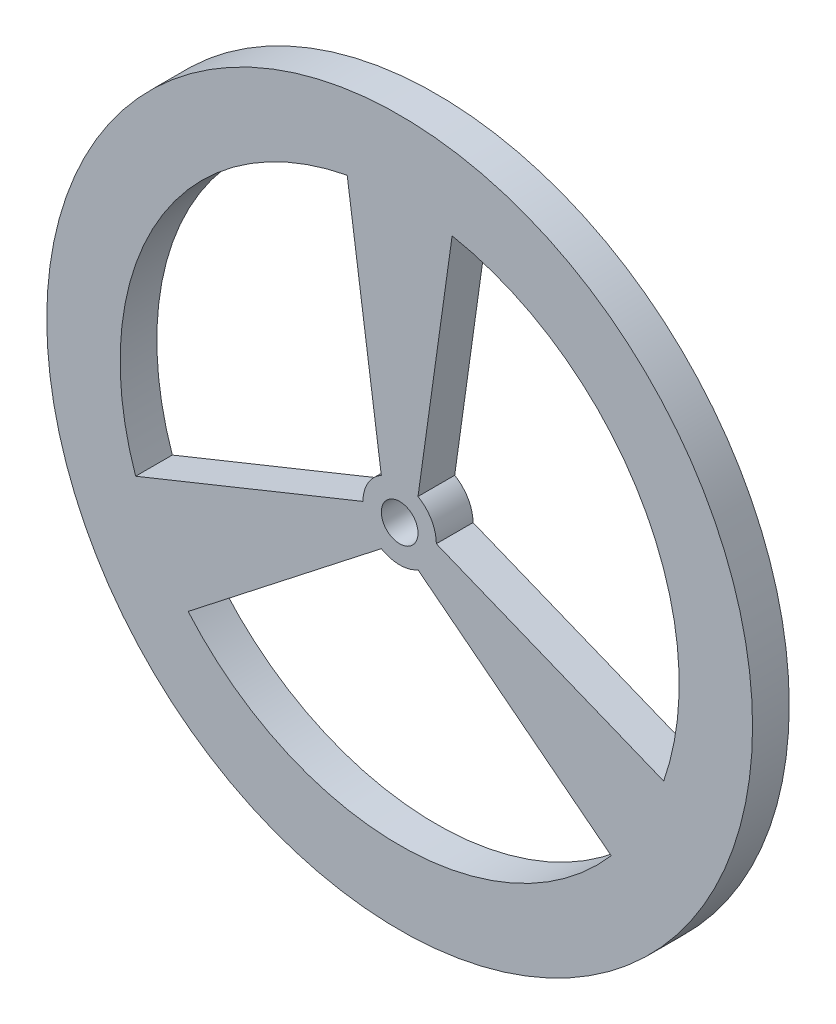
ISO-10303-21;
HEADER;
FILE_DESCRIPTION(('STEP AP214'),'2;1');
FILE_NAME('part.step','',(''),(''),'','','');
FILE_SCHEMA(('AUTOMOTIVE_DESIGN { 1 0 10303 214 1 1 1 1 }'));
ENDSEC;
DATA;
#1=APPLICATION_CONTEXT('core data for automotive mechanical design processes');
#2=APPLICATION_PROTOCOL_DEFINITION('international standard','automotive_design',2000,#1);
#3=PRODUCT_CONTEXT('',#1,'mechanical');
#4=PRODUCT('Part','Part','',(#3));
#5=PRODUCT_RELATED_PRODUCT_CATEGORY('part','',(#4));
#6=PRODUCT_DEFINITION_FORMATION('','',#4);
#7=PRODUCT_DEFINITION_CONTEXT('part definition',#1,'design');
#8=PRODUCT_DEFINITION('design','',#6,#7);
#9=PRODUCT_DEFINITION_SHAPE('','',#8);
#10=(LENGTH_UNIT() NAMED_UNIT(*) SI_UNIT(.MILLI.,.METRE.));
#11=(NAMED_UNIT(*) PLANE_ANGLE_UNIT() SI_UNIT($,.RADIAN.));
#12=(NAMED_UNIT(*) SI_UNIT($,.STERADIAN.) SOLID_ANGLE_UNIT());
#13=UNCERTAINTY_MEASURE_WITH_UNIT(LENGTH_MEASURE(1.E-05),#10,'distance_accuracy_value','');
#14=(GEOMETRIC_REPRESENTATION_CONTEXT(3) GLOBAL_UNCERTAINTY_ASSIGNED_CONTEXT((#13)) GLOBAL_UNIT_ASSIGNED_CONTEXT((#10,
#11,#12)) REPRESENTATION_CONTEXT('',''));
#15=CARTESIAN_POINT('',(0.,0.,0.));
#16=DIRECTION('',(0.,0.,1.));
#17=DIRECTION('',(1.,0.,0.));
#18=AXIS2_PLACEMENT_3D('',#15,#16,#17);
#19=CARTESIAN_POINT('',(0.,0.,5.));
#20=DIRECTION('',(0.,0.,-1.));
#21=DIRECTION('',(-1.,0.,0.));
#22=AXIS2_PLACEMENT_3D('',#19,#20,#21);
#23=CYLINDRICAL_SURFACE('',#22,5.);
#24=CARTESIAN_POINT('',(0.,0.,0.));
#25=DIRECTION('',(0.,0.,1.));
#26=DIRECTION('',(1.,0.,0.));
#27=AXIS2_PLACEMENT_3D('',#24,#25,#26);
#28=CIRCLE('',#27,5.);
#29=CARTESIAN_POINT('',(5.,0.,0.));
#30=VERTEX_POINT('',#29);
#31=CARTESIAN_POINT('',(2.50000000000002,4.33012701892218,0.));
#32=VERTEX_POINT('',#31);
#33=EDGE_CURVE('E301',#30,#32,#28,.T.);
#34=ORIENTED_EDGE('',*,*,#33,.T.);
#35=DIRECTION('',(0.,0.,-1.));
#36=VECTOR('',#35,1.);
#37=CARTESIAN_POINT('',(2.50000000000002,4.33012701892218,5.));
#38=LINE('',#37,#36);
#39=CARTESIAN_POINT('',(2.50000000000002,4.33012701892218,5.));
#40=VERTEX_POINT('',#39);
#41=EDGE_CURVE('E11',#40,#32,#38,.T.);
#42=ORIENTED_EDGE('',*,*,#41,.F.);
#43=CARTESIAN_POINT('',(0.,0.,5.));
#44=DIRECTION('',(0.,0.,1.));
#45=DIRECTION('',(1.,0.,0.));
#46=AXIS2_PLACEMENT_3D('',#43,#44,#45);
#47=CIRCLE('',#46,5.);
#48=CARTESIAN_POINT('',(5.,0.,5.));
#49=VERTEX_POINT('',#48);
#50=EDGE_CURVE('E169',#49,#40,#47,.T.);
#51=ORIENTED_EDGE('',*,*,#50,.F.);
#52=DIRECTION('',(0.,0.,-1.));
#53=VECTOR('',#52,1.);
#54=CARTESIAN_POINT('',(5.,0.,5.));
#55=LINE('',#54,#53);
#56=EDGE_CURVE('E65',#49,#30,#55,.T.);
#57=ORIENTED_EDGE('',*,*,#56,.T.);
#58=EDGE_LOOP('',(#34,#42,#51,#57));
#59=FACE_BOUND('',#58,.T.);
#60=ADVANCED_FACE('F42',(#59),#23,.T.);
#61=CARTESIAN_POINT('',(1.85480473899922,-0.260675806228889,5.));
#62=DIRECTION('',(-0.990268068741571,0.139173100960059,0.));
#63=DIRECTION('',(-0.139173100960059,-0.990268068741571,0.));
#64=AXIS2_PLACEMENT_3D('',#61,#62,#63);
#65=PLANE('',#64);
#66=DIRECTION('',(0.139173100960059,0.990268068741571,0.));
#67=VECTOR('',#66,1.);
#68=CARTESIAN_POINT('',(1.85480473899922,-0.260675806228889,0.));
#69=LINE('',#68,#67);
#70=CARTESIAN_POINT('',(7.15088847167686,37.422918032479,0.));
#71=VERTEX_POINT('',#70);
#72=EDGE_CURVE('E176',#32,#71,#69,.T.);
#73=ORIENTED_EDGE('',*,*,#72,.T.);
#74=DIRECTION('',(0.,0.,-1.));
#75=VECTOR('',#74,1.);
#76=CARTESIAN_POINT('',(7.15088847167686,37.422918032479,5.));
#77=LINE('',#76,#75);
#78=CARTESIAN_POINT('',(7.15088847167686,37.422918032479,5.));
#79=VERTEX_POINT('',#78);
#80=EDGE_CURVE('E53',#79,#71,#77,.T.);
#81=ORIENTED_EDGE('',*,*,#80,.F.);
#82=DIRECTION('',(0.139173100960059,0.990268068741571,0.));
#83=VECTOR('',#82,1.);
#84=CARTESIAN_POINT('',(1.85480473899922,-0.260675806228889,5.));
#85=LINE('',#84,#83);
#86=EDGE_CURVE('E162',#40,#79,#85,.T.);
#87=ORIENTED_EDGE('',*,*,#86,.F.);
#88=ORIENTED_EDGE('',*,*,#41,.T.);
#89=EDGE_LOOP('',(#73,#81,#87,#88));
#90=FACE_BOUND('',#89,.T.);
#91=ADVANCED_FACE('F175',(#90),#65,.F.);
#92=CARTESIAN_POINT('',(0.,0.,5.));
#93=DIRECTION('',(0.,0.,-1.));
#94=DIRECTION('',(-1.,0.,0.));
#95=AXIS2_PLACEMENT_3D('',#92,#93,#94);
#96=CYLINDRICAL_SURFACE('',#95,38.1);
#97=CARTESIAN_POINT('',(0.,0.,0.));
#98=DIRECTION('',(0.,0.,1.));
#99=DIRECTION('',(1.,0.,0.));
#100=AXIS2_PLACEMENT_3D('',#97,#98,#99);
#101=CIRCLE('',#100,38.1);
#102=CARTESIAN_POINT('',(35.984641935708,-12.518607940138,0.));
#103=VERTEX_POINT('',#102);
#104=EDGE_CURVE('E239',#103,#71,#101,.T.);
#105=ORIENTED_EDGE('',*,*,#104,.F.);
#106=DIRECTION('',(0.,0.,-1.));
#107=VECTOR('',#106,1.);
#108=CARTESIAN_POINT('',(35.984641935708,-12.518607940138,5.));
#109=LINE('',#108,#107);
#110=CARTESIAN_POINT('',(35.984641935708,-12.518607940138,5.));
#111=VERTEX_POINT('',#110);
#112=EDGE_CURVE('E114',#111,#103,#109,.T.);
#113=ORIENTED_EDGE('',*,*,#112,.F.);
#114=CARTESIAN_POINT('',(0.,0.,5.));
#115=DIRECTION('',(0.,0.,1.));
#116=DIRECTION('',(1.,0.,0.));
#117=AXIS2_PLACEMENT_3D('',#114,#115,#116);
#118=CIRCLE('',#117,38.1);
#119=EDGE_CURVE('E168',#111,#79,#118,.T.);
#120=ORIENTED_EDGE('',*,*,#119,.T.);
#121=ORIENTED_EDGE('',*,*,#80,.T.);
#122=EDGE_LOOP('',(#105,#113,#120,#121));
#123=FACE_BOUND('',#122,.T.);
#124=ADVANCED_FACE('F181',(#123),#96,.F.);
#125=CARTESIAN_POINT('',(1.15315423984581,-1.47597011991863,5.));
#126=DIRECTION('',(0.615661475325653,-0.788010753606726,0.));
#127=DIRECTION('',(0.788010753606726,0.615661475325653,0.));
#128=AXIS2_PLACEMENT_3D('',#125,#126,#127);
#129=PLANE('',#128);
#130=DIRECTION('',(-0.788010753606726,-0.615661475325653,0.));
#131=VECTOR('',#130,1.);
#132=CARTESIAN_POINT('',(1.15315423984581,-1.47597011991863,0.));
#133=LINE('',#132,#131);
#134=CARTESIAN_POINT('',(-2.49999999999999,-4.33012701892219,0.));
#135=VERTEX_POINT('',#134);
#136=CARTESIAN_POINT('',(-28.8337534640311,-24.9043100923409,0.));
#137=VERTEX_POINT('',#136);
#138=EDGE_CURVE('E293',#135,#137,#133,.T.);
#139=ORIENTED_EDGE('',*,*,#138,.F.);
#140=DIRECTION('',(0.,0.,-1.));
#141=VECTOR('',#140,1.);
#142=CARTESIAN_POINT('',(-2.49999999999999,-4.33012701892219,5.));
#143=LINE('',#142,#141);
#144=CARTESIAN_POINT('',(-2.49999999999999,-4.33012701892219,5.));
#145=VERTEX_POINT('',#144);
#146=EDGE_CURVE('E245',#145,#135,#143,.T.);
#147=ORIENTED_EDGE('',*,*,#146,.F.);
#148=DIRECTION('',(-0.788010753606726,-0.615661475325653,0.));
#149=VECTOR('',#148,1.);
#150=CARTESIAN_POINT('',(1.15315423984581,-1.47597011991863,5.));
#151=LINE('',#150,#149);
#152=CARTESIAN_POINT('',(-28.8337534640311,-24.9043100923409,5.));
#153=VERTEX_POINT('',#152);
#154=EDGE_CURVE('E209',#145,#153,#151,.T.);
#155=ORIENTED_EDGE('',*,*,#154,.T.);
#156=DIRECTION('',(0.,0.,-1.));
#157=VECTOR('',#156,1.);
#158=CARTESIAN_POINT('',(-28.8337534640311,-24.9043100923409,5.));
#159=LINE('',#158,#157);
#160=EDGE_CURVE('E248',#153,#137,#159,.T.);
#161=ORIENTED_EDGE('',*,*,#160,.T.);
#162=EDGE_LOOP('',(#139,#147,#155,#161));
#163=FACE_BOUND('',#162,.T.);
#164=ADVANCED_FACE('F340',(#163),#129,.T.);
#165=CARTESIAN_POINT('',(2.49999999999998,-4.3301270189222,0.));
#166=VERTEX_POINT('',#165);
#167=EDGE_CURVE('E296',#135,#166,#28,.T.);
#168=ORIENTED_EDGE('',*,*,#167,.T.);
#169=DIRECTION('',(0.,0.,-1.));
#170=VECTOR('',#169,1.);
#171=CARTESIAN_POINT('',(2.49999999999998,-4.3301270189222,5.));
#172=LINE('',#171,#170);
#173=CARTESIAN_POINT('',(2.49999999999998,-4.3301270189222,5.));
#174=VERTEX_POINT('',#173);
#175=EDGE_CURVE('E252',#174,#166,#172,.T.);
#176=ORIENTED_EDGE('',*,*,#175,.F.);
#177=EDGE_CURVE('E203',#145,#174,#47,.T.);
#178=ORIENTED_EDGE('',*,*,#177,.F.);
#179=ORIENTED_EDGE('',*,*,#146,.T.);
#180=EDGE_LOOP('',(#168,#176,#178,#179));
#181=FACE_BOUND('',#180,.T.);
#182=ADVANCED_FACE('F333',(#181),#23,.T.);
#183=CARTESIAN_POINT('',(-1.15315423984582,-1.47597011991865,5.));
#184=DIRECTION('',(0.615661475325653,0.788010753606726,0.));
#185=DIRECTION('',(-0.788010753606726,0.615661475325653,0.));
#186=AXIS2_PLACEMENT_3D('',#183,#184,#185);
#187=PLANE('',#186);
#188=DIRECTION('',(0.788010753606726,-0.615661475325653,0.));
#189=VECTOR('',#188,1.);
#190=CARTESIAN_POINT('',(-1.15315423984582,-1.47597011991865,0.));
#191=LINE('',#190,#189);
#192=CARTESIAN_POINT('',(28.8337534640311,-24.9043100923409,0.));
#193=VERTEX_POINT('',#192);
#194=EDGE_CURVE('E300',#166,#193,#191,.T.);
#195=ORIENTED_EDGE('',*,*,#194,.T.);
#196=DIRECTION('',(0.,0.,-1.));
#197=VECTOR('',#196,1.);
#198=CARTESIAN_POINT('',(28.8337534640311,-24.9043100923409,5.));
#199=LINE('',#198,#197);
#200=CARTESIAN_POINT('',(28.8337534640311,-24.9043100923409,5.));
#201=VERTEX_POINT('',#200);
#202=EDGE_CURVE('E250',#201,#193,#199,.T.);
#203=ORIENTED_EDGE('',*,*,#202,.F.);
#204=DIRECTION('',(0.788010753606726,-0.615661475325653,0.));
#205=VECTOR('',#204,1.);
#206=CARTESIAN_POINT('',(-1.15315423984582,-1.47597011991865,5.));
#207=LINE('',#206,#205);
#208=EDGE_CURVE('E195',#174,#201,#207,.T.);
#209=ORIENTED_EDGE('',*,*,#208,.F.);
#210=ORIENTED_EDGE('',*,*,#175,.T.);
#211=EDGE_LOOP('',(#195,#203,#209,#210));
#212=FACE_BOUND('',#211,.T.);
#213=ADVANCED_FACE('F339',(#212),#187,.F.);
#214=CARTESIAN_POINT('',(-1.8548047389992,-0.260675806228887,5.));
#215=DIRECTION('',(-0.990268068741571,-0.139173100960059,0.));
#216=DIRECTION('',(0.139173100960059,-0.990268068741571,0.));
#217=AXIS2_PLACEMENT_3D('',#214,#215,#216);
#218=PLANE('',#217);
#219=DIRECTION('',(-0.139173100960059,0.990268068741571,0.));
#220=VECTOR('',#219,1.);
#221=CARTESIAN_POINT('',(-1.8548047389992,-0.260675806228887,0.));
#222=LINE('',#221,#220);
#223=CARTESIAN_POINT('',(-2.5,4.33012701892219,0.));
#224=VERTEX_POINT('',#223);
#225=CARTESIAN_POINT('',(-7.15088847167684,37.422918032479,0.));
#226=VERTEX_POINT('',#225);
#227=EDGE_CURVE('E283',#224,#226,#222,.T.);
#228=ORIENTED_EDGE('',*,*,#227,.F.);
#229=DIRECTION('',(0.,0.,-1.));
#230=VECTOR('',#229,1.);
#231=CARTESIAN_POINT('',(-2.5,4.33012701892219,5.));
#232=LINE('',#231,#230);
#233=CARTESIAN_POINT('',(-2.5,4.33012701892219,5.));
#234=VERTEX_POINT('',#233);
#235=EDGE_CURVE('E46',#234,#224,#232,.T.);
#236=ORIENTED_EDGE('',*,*,#235,.F.);
#237=DIRECTION('',(-0.139173100960059,0.990268068741571,0.));
#238=VECTOR('',#237,1.);
#239=CARTESIAN_POINT('',(-1.8548047389992,-0.260675806228887,5.));
#240=LINE('',#239,#238);
#241=CARTESIAN_POINT('',(-7.15088847167684,37.422918032479,5.));
#242=VERTEX_POINT('',#241);
#243=EDGE_CURVE('E224',#234,#242,#240,.T.);
#244=ORIENTED_EDGE('',*,*,#243,.T.);
#245=DIRECTION('',(0.,0.,-1.));
#246=VECTOR('',#245,1.);
#247=CARTESIAN_POINT('',(-7.15088847167684,37.422918032479,5.));
#248=LINE('',#247,#246);
#249=EDGE_CURVE('E257',#242,#226,#248,.T.);
#250=ORIENTED_EDGE('',*,*,#249,.T.);
#251=EDGE_LOOP('',(#228,#236,#244,#250));
#252=FACE_BOUND('',#251,.T.);
#253=ADVANCED_FACE('F44',(#252),#218,.T.);
#254=CARTESIAN_POINT('',(0.,0.,5.));
#255=DIRECTION('',(0.,0.,-1.));
#256=DIRECTION('',(-1.,0.,0.));
#257=AXIS2_PLACEMENT_3D('',#254,#255,#256);
#258=CYLINDRICAL_SURFACE('',#257,5.);
#259=CARTESIAN_POINT('',(0.,0.,0.));
#260=DIRECTION('',(0.,0.,1.));
#261=DIRECTION('',(1.,0.,0.));
#262=AXIS2_PLACEMENT_3D('',#259,#260,#261);
#263=CIRCLE('',#262,5.);
#264=CARTESIAN_POINT('',(-5.,0.,0.));
#265=VERTEX_POINT('',#264);
#266=EDGE_CURVE('E277',#224,#265,#263,.T.);
#267=ORIENTED_EDGE('',*,*,#266,.T.);
#268=DIRECTION('',(0.,0.,-1.));
#269=VECTOR('',#268,1.);
#270=CARTESIAN_POINT('',(-5.,0.,5.));
#271=LINE('',#270,#269);
#272=CARTESIAN_POINT('',(-5.,0.,5.));
#273=VERTEX_POINT('',#272);
#274=EDGE_CURVE('E262',#273,#265,#271,.T.);
#275=ORIENTED_EDGE('',*,*,#274,.F.);
#276=CARTESIAN_POINT('',(0.,0.,5.));
#277=DIRECTION('',(0.,0.,1.));
#278=DIRECTION('',(1.,0.,0.));
#279=AXIS2_PLACEMENT_3D('',#276,#277,#278);
#280=CIRCLE('',#279,5.);
#281=EDGE_CURVE('E221',#234,#273,#280,.T.);
#282=ORIENTED_EDGE('',*,*,#281,.F.);
#283=ORIENTED_EDGE('',*,*,#235,.T.);
#284=EDGE_LOOP('',(#267,#275,#282,#283));
#285=FACE_BOUND('',#284,.T.);
#286=ADVANCED_FACE('F276',(#285),#258,.T.);
#287=CARTESIAN_POINT('',(-0.701650499153405,1.73664592614754,5.));
#288=DIRECTION('',(0.374606593415919,-0.927183854566785,0.));
#289=DIRECTION('',(0.927183854566785,0.374606593415919,0.));
#290=AXIS2_PLACEMENT_3D('',#287,#288,#289);
#291=PLANE('',#290);
#292=DIRECTION('',(-0.927183854566785,-0.374606593415919,0.));
#293=VECTOR('',#292,1.);
#294=CARTESIAN_POINT('',(-0.701650499153405,1.73664592614754,0.));
#295=LINE('',#294,#293);
#296=CARTESIAN_POINT('',(-35.984641935708,-12.5186079401381,0.));
#297=VERTEX_POINT('',#296);
#298=EDGE_CURVE('E285',#265,#297,#295,.T.);
#299=ORIENTED_EDGE('',*,*,#298,.T.);
#300=DIRECTION('',(0.,0.,-1.));
#301=VECTOR('',#300,1.);
#302=CARTESIAN_POINT('',(-35.984641935708,-12.5186079401381,5.));
#303=LINE('',#302,#301);
#304=CARTESIAN_POINT('',(-35.984641935708,-12.5186079401381,5.));
#305=VERTEX_POINT('',#304);
#306=EDGE_CURVE('E260',#305,#297,#303,.T.);
#307=ORIENTED_EDGE('',*,*,#306,.F.);
#308=DIRECTION('',(-0.927183854566785,-0.374606593415919,0.));
#309=VECTOR('',#308,1.);
#310=CARTESIAN_POINT('',(-0.701650499153405,1.73664592614754,5.));
#311=LINE('',#310,#309);
#312=EDGE_CURVE('E218',#273,#305,#311,.T.);
#313=ORIENTED_EDGE('',*,*,#312,.F.);
#314=ORIENTED_EDGE('',*,*,#274,.T.);
#315=EDGE_LOOP('',(#299,#307,#313,#314));
#316=FACE_BOUND('',#315,.T.);
#317=ADVANCED_FACE('F319',(#316),#291,.F.);
#318=CARTESIAN_POINT('',(0.701650499153396,1.73664592614752,5.));
#319=DIRECTION('',(0.374606593415918,0.927183854566785,0.));
#320=DIRECTION('',(-0.927183854566785,0.374606593415918,0.));
#321=AXIS2_PLACEMENT_3D('',#318,#319,#320);
#322=PLANE('',#321);
#323=DIRECTION('',(0.927183854566785,-0.374606593415918,0.));
#324=VECTOR('',#323,1.);
#325=CARTESIAN_POINT('',(0.701650499153396,1.73664592614752,0.));
#326=LINE('',#325,#324);
#327=EDGE_CURVE('E232',#30,#103,#326,.T.);
#328=ORIENTED_EDGE('',*,*,#327,.F.);
#329=ORIENTED_EDGE('',*,*,#56,.F.);
#330=DIRECTION('',(0.927183854566785,-0.374606593415918,0.));
#331=VECTOR('',#330,1.);
#332=CARTESIAN_POINT('',(0.701650499153396,1.73664592614752,5.));
#333=LINE('',#332,#331);
#334=EDGE_CURVE('E183',#49,#111,#333,.T.);
#335=ORIENTED_EDGE('',*,*,#334,.T.);
#336=ORIENTED_EDGE('',*,*,#112,.T.);
#337=EDGE_LOOP('',(#328,#329,#335,#336));
#338=FACE_BOUND('',#337,.T.);
#339=ADVANCED_FACE('F316',(#338),#322,.T.);
#340=CARTESIAN_POINT('',(0.,0.,5.));
#341=DIRECTION('',(0.,0.,-1.));
#342=DIRECTION('',(-1.,0.,0.));
#343=AXIS2_PLACEMENT_3D('',#340,#341,#342);
#344=CYLINDRICAL_SURFACE('',#343,2.5);
#345=CARTESIAN_POINT('',(0.,0.,5.));
#346=DIRECTION('',(0.,0.,1.));
#347=DIRECTION('',(1.,0.,0.));
#348=AXIS2_PLACEMENT_3D('',#345,#346,#347);
#349=CIRCLE('',#348,2.5);
#350=CARTESIAN_POINT('',(2.5,0.,5.));
#351=VERTEX_POINT('',#350);
#352=EDGE_CURVE('E194',#351,#351,#349,.T.);
#353=ORIENTED_EDGE('',*,*,#352,.T.);
#354=EDGE_LOOP('',(#353));
#355=FACE_BOUND('',#354,.T.);
#356=CARTESIAN_POINT('',(0.,0.,0.));
#357=DIRECTION('',(0.,0.,1.));
#358=DIRECTION('',(1.,0.,0.));
#359=AXIS2_PLACEMENT_3D('',#356,#357,#358);
#360=CIRCLE('',#359,2.5);
#361=CARTESIAN_POINT('',(2.5,0.,0.));
#362=VERTEX_POINT('',#361);
#363=EDGE_CURVE('E309',#362,#362,#360,.T.);
#364=ORIENTED_EDGE('',*,*,#363,.F.);
#365=EDGE_LOOP('',(#364));
#366=FACE_BOUND('',#365,.T.);
#367=ADVANCED_FACE('F318',(#355,#366),#344,.F.);
#368=EDGE_CURVE('E305',#137,#193,#101,.T.);
#369=ORIENTED_EDGE('',*,*,#368,.F.);
#370=ORIENTED_EDGE('',*,*,#160,.F.);
#371=EDGE_CURVE('E185',#153,#201,#118,.T.);
#372=ORIENTED_EDGE('',*,*,#371,.T.);
#373=ORIENTED_EDGE('',*,*,#202,.T.);
#374=EDGE_LOOP('',(#369,#370,#372,#373));
#375=FACE_BOUND('',#374,.T.);
#376=ADVANCED_FACE('F325',(#375),#96,.F.);
#377=CARTESIAN_POINT('',(0.,0.,5.));
#378=DIRECTION('',(0.,0.,-1.));
#379=DIRECTION('',(-1.,0.,0.));
#380=AXIS2_PLACEMENT_3D('',#377,#378,#379);
#381=CYLINDRICAL_SURFACE('',#380,38.1);
#382=CARTESIAN_POINT('',(0.,0.,0.));
#383=DIRECTION('',(0.,0.,1.));
#384=DIRECTION('',(1.,0.,0.));
#385=AXIS2_PLACEMENT_3D('',#382,#383,#384);
#386=CIRCLE('',#385,38.1);
#387=EDGE_CURVE('E291',#226,#297,#386,.T.);
#388=ORIENTED_EDGE('',*,*,#387,.F.);
#389=ORIENTED_EDGE('',*,*,#249,.F.);
#390=CARTESIAN_POINT('',(0.,0.,5.));
#391=DIRECTION('',(0.,0.,1.));
#392=DIRECTION('',(1.,0.,0.));
#393=AXIS2_PLACEMENT_3D('',#390,#391,#392);
#394=CIRCLE('',#393,38.1);
#395=EDGE_CURVE('E214',#242,#305,#394,.T.);
#396=ORIENTED_EDGE('',*,*,#395,.T.);
#397=ORIENTED_EDGE('',*,*,#306,.T.);
#398=EDGE_LOOP('',(#388,#389,#396,#397));
#399=FACE_BOUND('',#398,.T.);
#400=ADVANCED_FACE('F370',(#399),#381,.F.);
#401=CARTESIAN_POINT('',(0.,0.,5.));
#402=DIRECTION('',(0.,0.,-1.));
#403=DIRECTION('',(-1.,0.,0.));
#404=AXIS2_PLACEMENT_3D('',#401,#402,#403);
#405=CYLINDRICAL_SURFACE('',#404,48.1);
#406=CARTESIAN_POINT('',(0.,0.,5.));
#407=DIRECTION('',(0.,0.,1.));
#408=DIRECTION('',(1.,0.,0.));
#409=AXIS2_PLACEMENT_3D('',#406,#407,#408);
#410=CIRCLE('',#409,48.1);
#411=CARTESIAN_POINT('',(48.1,0.,5.));
#412=VERTEX_POINT('',#411);
#413=EDGE_CURVE('E188',#412,#412,#410,.T.);
#414=ORIENTED_EDGE('',*,*,#413,.F.);
#415=EDGE_LOOP('',(#414));
#416=FACE_BOUND('',#415,.T.);
#417=CARTESIAN_POINT('',(0.,0.,0.));
#418=DIRECTION('',(0.,0.,1.));
#419=DIRECTION('',(1.,0.,0.));
#420=AXIS2_PLACEMENT_3D('',#417,#418,#419);
#421=CIRCLE('',#420,48.1);
#422=CARTESIAN_POINT('',(48.1,0.,0.));
#423=VERTEX_POINT('',#422);
#424=EDGE_CURVE('E226',#423,#423,#421,.T.);
#425=ORIENTED_EDGE('',*,*,#424,.T.);
#426=EDGE_LOOP('',(#425));
#427=FACE_BOUND('',#426,.T.);
#428=ADVANCED_FACE('F359',(#416,#427),#405,.T.);
#429=CARTESIAN_POINT('',(0.,0.,5.));
#430=DIRECTION('',(0.,0.,1.));
#431=DIRECTION('',(1.,0.,0.));
#432=AXIS2_PLACEMENT_3D('',#429,#430,#431);
#433=PLANE('',#432);
#434=ORIENTED_EDGE('',*,*,#243,.F.);
#435=ORIENTED_EDGE('',*,*,#281,.T.);
#436=ORIENTED_EDGE('',*,*,#312,.T.);
#437=ORIENTED_EDGE('',*,*,#395,.F.);
#438=EDGE_LOOP('',(#434,#435,#436,#437));
#439=FACE_BOUND('',#438,.T.);
#440=ORIENTED_EDGE('',*,*,#154,.F.);
#441=ORIENTED_EDGE('',*,*,#177,.T.);
#442=ORIENTED_EDGE('',*,*,#208,.T.);
#443=ORIENTED_EDGE('',*,*,#371,.F.);
#444=EDGE_LOOP('',(#440,#441,#442,#443));
#445=FACE_BOUND('',#444,.T.);
#446=ORIENTED_EDGE('',*,*,#352,.F.);
#447=EDGE_LOOP('',(#446));
#448=FACE_BOUND('',#447,.T.);
#449=ORIENTED_EDGE('',*,*,#50,.T.);
#450=ORIENTED_EDGE('',*,*,#86,.T.);
#451=ORIENTED_EDGE('',*,*,#119,.F.);
#452=ORIENTED_EDGE('',*,*,#334,.F.);
#453=EDGE_LOOP('',(#449,#450,#451,#452));
#454=FACE_BOUND('',#453,.T.);
#455=ORIENTED_EDGE('',*,*,#413,.T.);
#456=EDGE_LOOP('',(#455));
#457=FACE_BOUND('',#456,.T.);
#458=ADVANCED_FACE('F164',(#439,#445,#448,#454,#457),#433,.T.);
#459=CARTESIAN_POINT('',(0.,0.,0.));
#460=DIRECTION('',(0.,0.,1.));
#461=DIRECTION('',(1.,0.,0.));
#462=AXIS2_PLACEMENT_3D('',#459,#460,#461);
#463=PLANE('',#462);
#464=ORIENTED_EDGE('',*,*,#227,.T.);
#465=ORIENTED_EDGE('',*,*,#387,.T.);
#466=ORIENTED_EDGE('',*,*,#298,.F.);
#467=ORIENTED_EDGE('',*,*,#266,.F.);
#468=EDGE_LOOP('',(#464,#465,#466,#467));
#469=FACE_BOUND('',#468,.T.);
#470=ORIENTED_EDGE('',*,*,#138,.T.);
#471=ORIENTED_EDGE('',*,*,#368,.T.);
#472=ORIENTED_EDGE('',*,*,#194,.F.);
#473=ORIENTED_EDGE('',*,*,#167,.F.);
#474=EDGE_LOOP('',(#470,#471,#472,#473));
#475=FACE_BOUND('',#474,.T.);
#476=ORIENTED_EDGE('',*,*,#363,.T.);
#477=EDGE_LOOP('',(#476));
#478=FACE_BOUND('',#477,.T.);
#479=ORIENTED_EDGE('',*,*,#33,.F.);
#480=ORIENTED_EDGE('',*,*,#327,.T.);
#481=ORIENTED_EDGE('',*,*,#104,.T.);
#482=ORIENTED_EDGE('',*,*,#72,.F.);
#483=EDGE_LOOP('',(#479,#480,#481,#482));
#484=FACE_BOUND('',#483,.T.);
#485=ORIENTED_EDGE('',*,*,#424,.F.);
#486=EDGE_LOOP('',(#485));
#487=FACE_BOUND('',#486,.T.);
#488=ADVANCED_FACE('F280',(#469,#475,#478,#484,#487),#463,.F.);
#489=CLOSED_SHELL('',(#60,#91,#124,#164,#182,#213,#253,#286,#317,#339,#367,#376,#400,#428,#458,#488));
#490=MANIFOLD_SOLID_BREP('B2',#489);
#491=ADVANCED_BREP_SHAPE_REPRESENTATION('',(#18,#490),#14);
#492=SHAPE_DEFINITION_REPRESENTATION(#9,#491);
ENDSEC;
END-ISO-10303-21;
